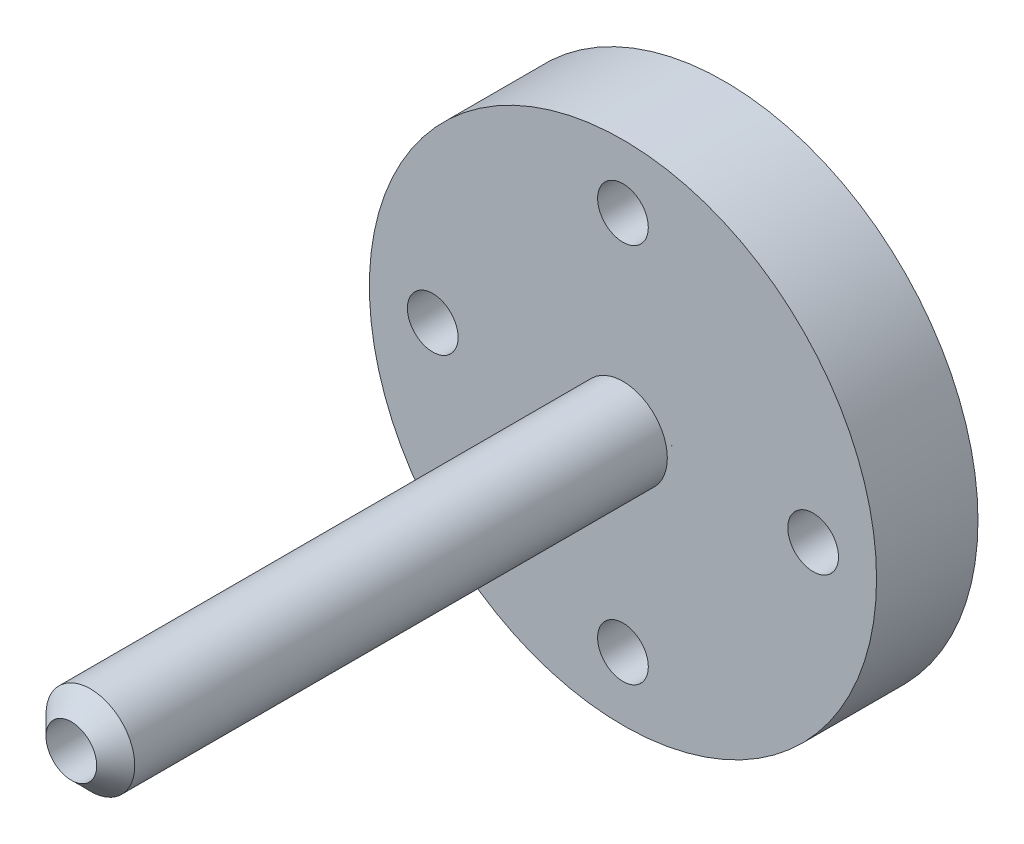
ISO-10303-21;
HEADER;
FILE_DESCRIPTION(('STEP AP214'),'2;1');
FILE_NAME('part.step','',(''),(''),'','','');
FILE_SCHEMA(('AUTOMOTIVE_DESIGN { 1 0 10303 214 1 1 1 1 }'));
ENDSEC;
DATA;
#1=APPLICATION_CONTEXT('core data for automotive mechanical design processes');
#2=APPLICATION_PROTOCOL_DEFINITION('international standard','automotive_design',2000,#1);
#3=PRODUCT_CONTEXT('',#1,'mechanical');
#4=PRODUCT('Part','Part','',(#3));
#5=PRODUCT_RELATED_PRODUCT_CATEGORY('part','',(#4));
#6=PRODUCT_DEFINITION_FORMATION('','',#4);
#7=PRODUCT_DEFINITION_CONTEXT('part definition',#1,'design');
#8=PRODUCT_DEFINITION('design','',#6,#7);
#9=PRODUCT_DEFINITION_SHAPE('','',#8);
#10=(LENGTH_UNIT() NAMED_UNIT(*) SI_UNIT(.MILLI.,.METRE.));
#11=(NAMED_UNIT(*) PLANE_ANGLE_UNIT() SI_UNIT($,.RADIAN.));
#12=(NAMED_UNIT(*) SI_UNIT($,.STERADIAN.) SOLID_ANGLE_UNIT());
#13=UNCERTAINTY_MEASURE_WITH_UNIT(LENGTH_MEASURE(1.E-05),#10,'distance_accuracy_value','');
#14=(GEOMETRIC_REPRESENTATION_CONTEXT(3) GLOBAL_UNCERTAINTY_ASSIGNED_CONTEXT((#13)) GLOBAL_UNIT_ASSIGNED_CONTEXT((#10,
#11,#12)) REPRESENTATION_CONTEXT('',''));
#15=CARTESIAN_POINT('',(0.,0.,0.));
#16=DIRECTION('',(0.,0.,1.));
#17=DIRECTION('',(1.,0.,0.));
#18=AXIS2_PLACEMENT_3D('',#15,#16,#17);
#19=CARTESIAN_POINT('',(0.,0.,4.));
#20=DIRECTION('',(0.,0.,-1.));
#21=DIRECTION('',(-1.,0.,0.));
#22=AXIS2_PLACEMENT_3D('',#19,#20,#21);
#23=CYLINDRICAL_SURFACE('',#22,1.75);
#24=CARTESIAN_POINT('',(0.,0.,4.));
#25=DIRECTION('',(0.,0.,1.));
#26=DIRECTION('',(1.,0.,0.));
#27=AXIS2_PLACEMENT_3D('',#24,#25,#26);
#28=CIRCLE('',#27,1.75);
#29=CARTESIAN_POINT('',(1.75,0.,4.));
#30=VERTEX_POINT('',#29);
#31=EDGE_CURVE('E50',#30,#30,#28,.T.);
#32=ORIENTED_EDGE('',*,*,#31,.T.);
#33=EDGE_LOOP('',(#32));
#34=FACE_BOUND('',#33,.T.);
#35=CARTESIAN_POINT('',(0.,0.,0.));
#36=DIRECTION('',(0.,0.,1.));
#37=DIRECTION('',(1.,0.,0.));
#38=AXIS2_PLACEMENT_3D('',#35,#36,#37);
#39=CIRCLE('',#38,1.75);
#40=CARTESIAN_POINT('',(1.75,0.,0.));
#41=VERTEX_POINT('',#40);
#42=EDGE_CURVE('E11',#41,#41,#39,.T.);
#43=ORIENTED_EDGE('',*,*,#42,.F.);
#44=EDGE_LOOP('',(#43));
#45=FACE_BOUND('',#44,.T.);
#46=ADVANCED_FACE('F46',(#34,#45),#23,.F.);
#47=OPEN_SHELL('',(#46));
#48=SHELL_BASED_SURFACE_MODEL('B2',(#47));
#49=CARTESIAN_POINT('',(0.,0.,4.));
#50=DIRECTION('',(0.,0.,1.));
#51=DIRECTION('',(1.,0.,0.));
#52=AXIS2_PLACEMENT_3D('',#49,#50,#51);
#53=PLANE('',#52);
#54=CARTESIAN_POINT('',(0.,-7.49999999999999,4.));
#55=DIRECTION('',(0.,0.,1.));
#56=DIRECTION('',(1.,0.,0.));
#57=AXIS2_PLACEMENT_3D('',#54,#55,#56);
#58=CIRCLE('',#57,1.);
#59=CARTESIAN_POINT('',(1.,-7.49999999999999,4.));
#60=VERTEX_POINT('',#59);
#61=EDGE_CURVE('E115',#60,#60,#58,.T.);
#62=ORIENTED_EDGE('',*,*,#61,.F.);
#63=EDGE_LOOP('',(#62));
#64=FACE_BOUND('',#63,.T.);
#65=CARTESIAN_POINT('',(7.50000000000001,0.,4.));
#66=DIRECTION('',(0.,0.,1.));
#67=DIRECTION('',(1.,0.,0.));
#68=AXIS2_PLACEMENT_3D('',#65,#66,#67);
#69=CIRCLE('',#68,1.);
#70=CARTESIAN_POINT('',(8.50000000000001,0.,4.));
#71=VERTEX_POINT('',#70);
#72=EDGE_CURVE('E109',#71,#71,#69,.T.);
#73=ORIENTED_EDGE('',*,*,#72,.F.);
#74=EDGE_LOOP('',(#73));
#75=FACE_BOUND('',#74,.T.);
#76=CARTESIAN_POINT('',(-7.50000000000001,0.,4.));
#77=DIRECTION('',(0.,0.,1.));
#78=DIRECTION('',(1.,0.,0.));
#79=AXIS2_PLACEMENT_3D('',#76,#77,#78);
#80=CIRCLE('',#79,1.);
#81=CARTESIAN_POINT('',(-6.50000000000001,0.,4.));
#82=VERTEX_POINT('',#81);
#83=EDGE_CURVE('E103',#82,#82,#80,.T.);
#84=ORIENTED_EDGE('',*,*,#83,.F.);
#85=EDGE_LOOP('',(#84));
#86=FACE_BOUND('',#85,.T.);
#87=CARTESIAN_POINT('',(0.,7.49999999999999,4.));
#88=DIRECTION('',(0.,0.,1.));
#89=DIRECTION('',(1.,0.,0.));
#90=AXIS2_PLACEMENT_3D('',#87,#88,#89);
#91=CIRCLE('',#90,1.);
#92=CARTESIAN_POINT('',(1.,7.49999999999999,4.));
#93=VERTEX_POINT('',#92);
#94=EDGE_CURVE('E97',#93,#93,#91,.T.);
#95=ORIENTED_EDGE('',*,*,#94,.F.);
#96=EDGE_LOOP('',(#95));
#97=FACE_BOUND('',#96,.T.);
#98=CARTESIAN_POINT('',(0.,0.,4.));
#99=DIRECTION('',(0.,0.,1.));
#100=DIRECTION('',(1.,0.,0.));
#101=AXIS2_PLACEMENT_3D('',#98,#99,#100);
#102=CIRCLE('',#101,10.);
#103=CARTESIAN_POINT('',(10.,0.,4.));
#104=VERTEX_POINT('',#103);
#105=EDGE_CURVE('E81',#104,#104,#102,.T.);
#106=ORIENTED_EDGE('',*,*,#105,.T.);
#107=EDGE_LOOP('',(#106));
#108=FACE_BOUND('',#107,.T.);
#109=CARTESIAN_POINT('',(0.,0.,4.));
#110=DIRECTION('',(0.,0.,1.));
#111=DIRECTION('',(1.,0.,0.));
#112=AXIS2_PLACEMENT_3D('',#109,#110,#111);
#113=CIRCLE('',#112,1.75);
#114=CARTESIAN_POINT('',(1.75,0.,4.));
#115=VERTEX_POINT('',#114);
#116=EDGE_CURVE('E93',#115,#115,#113,.T.);
#117=ORIENTED_EDGE('',*,*,#116,.F.);
#118=EDGE_LOOP('',(#117));
#119=FACE_BOUND('',#118,.T.);
#120=ADVANCED_FACE('F70',(#64,#75,#86,#97,#108,#119),#53,.T.);
#121=CARTESIAN_POINT('',(0.,0.,0.));
#122=DIRECTION('',(0.,0.,1.));
#123=DIRECTION('',(1.,0.,0.));
#124=AXIS2_PLACEMENT_3D('',#121,#122,#123);
#125=PLANE('',#124);
#126=CARTESIAN_POINT('',(0.,-7.49999999999999,0.));
#127=DIRECTION('',(0.,0.,1.));
#128=DIRECTION('',(1.,0.,0.));
#129=AXIS2_PLACEMENT_3D('',#126,#127,#128);
#130=CIRCLE('',#129,1.);
#131=CARTESIAN_POINT('',(1.,-7.49999999999999,0.));
#132=VERTEX_POINT('',#131);
#133=EDGE_CURVE('E112',#132,#132,#130,.T.);
#134=ORIENTED_EDGE('',*,*,#133,.T.);
#135=EDGE_LOOP('',(#134));
#136=FACE_BOUND('',#135,.T.);
#137=CARTESIAN_POINT('',(7.50000000000001,0.,0.));
#138=DIRECTION('',(0.,0.,1.));
#139=DIRECTION('',(1.,0.,0.));
#140=AXIS2_PLACEMENT_3D('',#137,#138,#139);
#141=CIRCLE('',#140,1.);
#142=CARTESIAN_POINT('',(8.50000000000001,0.,0.));
#143=VERTEX_POINT('',#142);
#144=EDGE_CURVE('E106',#143,#143,#141,.T.);
#145=ORIENTED_EDGE('',*,*,#144,.T.);
#146=EDGE_LOOP('',(#145));
#147=FACE_BOUND('',#146,.T.);
#148=CARTESIAN_POINT('',(-7.50000000000001,0.,0.));
#149=DIRECTION('',(0.,0.,1.));
#150=DIRECTION('',(1.,0.,0.));
#151=AXIS2_PLACEMENT_3D('',#148,#149,#150);
#152=CIRCLE('',#151,1.);
#153=CARTESIAN_POINT('',(-6.50000000000001,0.,0.));
#154=VERTEX_POINT('',#153);
#155=EDGE_CURVE('E100',#154,#154,#152,.T.);
#156=ORIENTED_EDGE('',*,*,#155,.T.);
#157=EDGE_LOOP('',(#156));
#158=FACE_BOUND('',#157,.T.);
#159=CARTESIAN_POINT('',(0.,7.49999999999999,0.));
#160=DIRECTION('',(0.,0.,1.));
#161=DIRECTION('',(1.,0.,0.));
#162=AXIS2_PLACEMENT_3D('',#159,#160,#161);
#163=CIRCLE('',#162,1.);
#164=CARTESIAN_POINT('',(1.,7.49999999999999,0.));
#165=VERTEX_POINT('',#164);
#166=EDGE_CURVE('E96',#165,#165,#163,.T.);
#167=ORIENTED_EDGE('',*,*,#166,.T.);
#168=EDGE_LOOP('',(#167));
#169=FACE_BOUND('',#168,.T.);
#170=CARTESIAN_POINT('',(0.,0.,0.));
#171=DIRECTION('',(0.,0.,1.));
#172=DIRECTION('',(1.,0.,0.));
#173=AXIS2_PLACEMENT_3D('',#170,#171,#172);
#174=CIRCLE('',#173,10.);
#175=CARTESIAN_POINT('',(10.,0.,0.));
#176=VERTEX_POINT('',#175);
#177=EDGE_CURVE('E85',#176,#176,#174,.T.);
#178=ORIENTED_EDGE('',*,*,#177,.F.);
#179=EDGE_LOOP('',(#178));
#180=FACE_BOUND('',#179,.T.);
#181=CARTESIAN_POINT('',(0.,0.,0.));
#182=DIRECTION('',(0.,0.,1.));
#183=DIRECTION('',(1.,0.,0.));
#184=AXIS2_PLACEMENT_3D('',#181,#182,#183);
#185=CIRCLE('',#184,1.);
#186=CARTESIAN_POINT('',(1.,0.,0.));
#187=VERTEX_POINT('',#186);
#188=EDGE_CURVE('E89',#187,#187,#185,.T.);
#189=ORIENTED_EDGE('',*,*,#188,.T.);
#190=EDGE_LOOP('',(#189));
#191=FACE_BOUND('',#190,.T.);
#192=ADVANCED_FACE('F121',(#136,#147,#158,#169,#180,#191),#125,.F.);
#193=CARTESIAN_POINT('',(0.,0.,4.));
#194=DIRECTION('',(0.,0.,-1.));
#195=DIRECTION('',(-1.,0.,0.));
#196=AXIS2_PLACEMENT_3D('',#193,#194,#195);
#197=CYLINDRICAL_SURFACE('',#196,10.);
#198=ORIENTED_EDGE('',*,*,#105,.F.);
#199=EDGE_LOOP('',(#198));
#200=FACE_BOUND('',#199,.T.);
#201=ORIENTED_EDGE('',*,*,#177,.T.);
#202=EDGE_LOOP('',(#201));
#203=FACE_BOUND('',#202,.T.);
#204=ADVANCED_FACE('F154',(#200,#203),#197,.T.);
#205=CARTESIAN_POINT('',(0.,0.,4.));
#206=DIRECTION('',(0.,0.,-1.));
#207=DIRECTION('',(-1.,0.,0.));
#208=AXIS2_PLACEMENT_3D('',#205,#206,#207);
#209=CYLINDRICAL_SURFACE('',#208,1.);
#210=CARTESIAN_POINT('',(0.,0.,25.75));
#211=DIRECTION('',(0.,0.,-1.));
#212=DIRECTION('',(-1.,0.,0.));
#213=AXIS2_PLACEMENT_3D('',#210,#211,#212);
#214=CIRCLE('',#213,1.);
#215=CARTESIAN_POINT('',(-1.,0.,25.75));
#216=VERTEX_POINT('',#215);
#217=EDGE_CURVE('E77',#216,#216,#214,.F.);
#218=ORIENTED_EDGE('',*,*,#217,.T.);
#219=EDGE_LOOP('',(#218));
#220=FACE_BOUND('',#219,.T.);
#221=ORIENTED_EDGE('',*,*,#188,.F.);
#222=EDGE_LOOP('',(#221));
#223=FACE_BOUND('',#222,.T.);
#224=ADVANCED_FACE('F146',(#220,#223),#209,.F.);
#225=CARTESIAN_POINT('',(0.,0.,26.));
#226=DIRECTION('',(0.,0.,-1.));
#227=DIRECTION('',(-1.,0.,0.));
#228=AXIS2_PLACEMENT_3D('',#225,#226,#227);
#229=CYLINDRICAL_SURFACE('',#228,1.75);
#230=CARTESIAN_POINT('',(0.,0.,25.));
#231=DIRECTION('',(0.,0.,1.));
#232=DIRECTION('',(1.,0.,0.));
#233=AXIS2_PLACEMENT_3D('',#230,#231,#232);
#234=CIRCLE('',#233,1.75);
#235=CARTESIAN_POINT('',(1.75,0.,25.));
#236=VERTEX_POINT('',#235);
#237=EDGE_CURVE('E45',#236,#236,#234,.F.);
#238=ORIENTED_EDGE('',*,*,#237,.T.);
#239=EDGE_LOOP('',(#238));
#240=FACE_BOUND('',#239,.T.);
#241=ORIENTED_EDGE('',*,*,#116,.T.);
#242=EDGE_LOOP('',(#241));
#243=FACE_BOUND('',#242,.T.);
#244=ADVANCED_FACE('F144',(#240,#243),#229,.T.);
#245=CARTESIAN_POINT('',(0.,0.,26.));
#246=DIRECTION('',(0.,0.,-1.));
#247=DIRECTION('',(-1.,0.,0.));
#248=AXIS2_PLACEMENT_3D('',#245,#246,#247);
#249=CONICAL_SURFACE('',#248,0.749999999999982,0.785398163397453);
#250=ORIENTED_EDGE('',*,*,#237,.F.);
#251=EDGE_LOOP('',(#250));
#252=FACE_BOUND('',#251,.T.);
#253=ORIENTED_EDGE('',*,*,#217,.F.);
#254=EDGE_LOOP('',(#253));
#255=FACE_BOUND('',#254,.T.);
#256=ADVANCED_FACE('F72',(#252,#255),#249,.T.);
#257=CARTESIAN_POINT('',(0.,7.49999999999999,0.));
#258=DIRECTION('',(0.,0.,1.));
#259=DIRECTION('',(1.,0.,0.));
#260=AXIS2_PLACEMENT_3D('',#257,#258,#259);
#261=CYLINDRICAL_SURFACE('',#260,1.);
#262=ORIENTED_EDGE('',*,*,#166,.F.);
#263=EDGE_LOOP('',(#262));
#264=FACE_BOUND('',#263,.T.);
#265=ORIENTED_EDGE('',*,*,#94,.T.);
#266=EDGE_LOOP('',(#265));
#267=FACE_BOUND('',#266,.T.);
#268=ADVANCED_FACE('F152',(#264,#267),#261,.F.);
#269=CARTESIAN_POINT('',(-7.50000000000001,0.,0.));
#270=DIRECTION('',(0.,0.,1.));
#271=DIRECTION('',(1.,0.,0.));
#272=AXIS2_PLACEMENT_3D('',#269,#270,#271);
#273=CYLINDRICAL_SURFACE('',#272,1.);
#274=ORIENTED_EDGE('',*,*,#155,.F.);
#275=EDGE_LOOP('',(#274));
#276=FACE_BOUND('',#275,.T.);
#277=ORIENTED_EDGE('',*,*,#83,.T.);
#278=EDGE_LOOP('',(#277));
#279=FACE_BOUND('',#278,.T.);
#280=ADVANCED_FACE('F197',(#276,#279),#273,.F.);
#281=CARTESIAN_POINT('',(7.50000000000001,0.,0.));
#282=DIRECTION('',(0.,0.,1.));
#283=DIRECTION('',(1.,0.,0.));
#284=AXIS2_PLACEMENT_3D('',#281,#282,#283);
#285=CYLINDRICAL_SURFACE('',#284,1.);
#286=ORIENTED_EDGE('',*,*,#144,.F.);
#287=EDGE_LOOP('',(#286));
#288=FACE_BOUND('',#287,.T.);
#289=ORIENTED_EDGE('',*,*,#72,.T.);
#290=EDGE_LOOP('',(#289));
#291=FACE_BOUND('',#290,.T.);
#292=ADVANCED_FACE('F127',(#288,#291),#285,.F.);
#293=CARTESIAN_POINT('',(0.,-7.49999999999999,0.));
#294=DIRECTION('',(0.,0.,1.));
#295=DIRECTION('',(1.,0.,0.));
#296=AXIS2_PLACEMENT_3D('',#293,#294,#295);
#297=CYLINDRICAL_SURFACE('',#296,1.);
#298=ORIENTED_EDGE('',*,*,#133,.F.);
#299=EDGE_LOOP('',(#298));
#300=FACE_BOUND('',#299,.T.);
#301=ORIENTED_EDGE('',*,*,#61,.T.);
#302=EDGE_LOOP('',(#301));
#303=FACE_BOUND('',#302,.T.);
#304=ADVANCED_FACE('F124',(#300,#303),#297,.F.);
#305=CLOSED_SHELL('',(#120,#192,#204,#224,#244,#256,#268,#280,#292,#304));
#306=MANIFOLD_SOLID_BREP('B6',#305);
#307=ADVANCED_BREP_SHAPE_REPRESENTATION('',(#18,#306),#14);
#308=MANIFOLD_SURFACE_SHAPE_REPRESENTATION('',(#18,#48),#14);
#309=SHAPE_REPRESENTATION('',(#18),#14);
#310=SHAPE_DEFINITION_REPRESENTATION(#9,#309);
#311=SHAPE_REPRESENTATION_RELATIONSHIP('','',#309,#307);
#312=SHAPE_REPRESENTATION_RELATIONSHIP('','',#309,#308);
ENDSEC;
END-ISO-10303-21;
